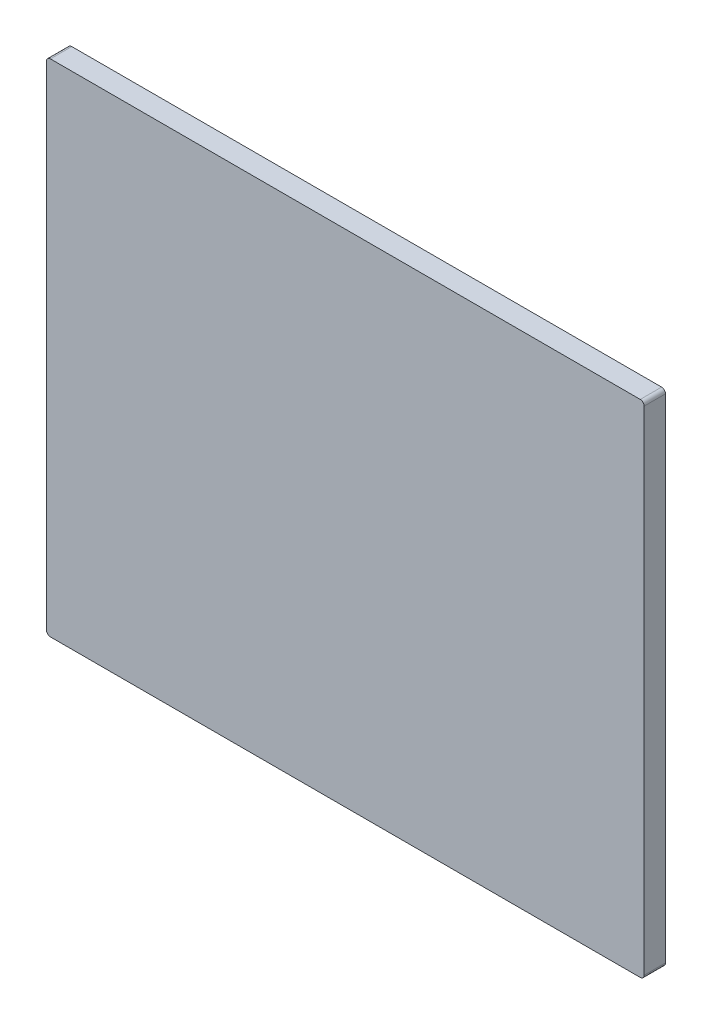
ISO-10303-21;
HEADER;
FILE_DESCRIPTION(('STEP AP214'),'2;1');
FILE_NAME('part.step','',(''),(''),'','','');
FILE_SCHEMA(('AUTOMOTIVE_DESIGN { 1 0 10303 214 1 1 1 1 }'));
ENDSEC;
DATA;
#1=APPLICATION_CONTEXT('core data for automotive mechanical design processes');
#2=APPLICATION_PROTOCOL_DEFINITION('international standard','automotive_design',2000,#1);
#3=PRODUCT_CONTEXT('',#1,'mechanical');
#4=PRODUCT('Part','Part','',(#3));
#5=PRODUCT_RELATED_PRODUCT_CATEGORY('part','',(#4));
#6=PRODUCT_DEFINITION_FORMATION('','',#4);
#7=PRODUCT_DEFINITION_CONTEXT('part definition',#1,'design');
#8=PRODUCT_DEFINITION('design','',#6,#7);
#9=PRODUCT_DEFINITION_SHAPE('','',#8);
#10=(LENGTH_UNIT() NAMED_UNIT(*) SI_UNIT(.MILLI.,.METRE.));
#11=(NAMED_UNIT(*) PLANE_ANGLE_UNIT() SI_UNIT($,.RADIAN.));
#12=(NAMED_UNIT(*) SI_UNIT($,.STERADIAN.) SOLID_ANGLE_UNIT());
#13=UNCERTAINTY_MEASURE_WITH_UNIT(LENGTH_MEASURE(1.E-05),#10,'distance_accuracy_value','');
#14=(GEOMETRIC_REPRESENTATION_CONTEXT(3) GLOBAL_UNCERTAINTY_ASSIGNED_CONTEXT((#13)) GLOBAL_UNIT_ASSIGNED_CONTEXT((#10,
#11,#12)) REPRESENTATION_CONTEXT('',''));
#15=CARTESIAN_POINT('',(0.,0.,0.));
#16=DIRECTION('',(0.,0.,1.));
#17=DIRECTION('',(1.,0.,0.));
#18=AXIS2_PLACEMENT_3D('',#15,#16,#17);
#19=CARTESIAN_POINT('',(154.,-129.,11.));
#20=DIRECTION('',(-1.,0.,0.));
#21=DIRECTION('',(0.,0.,1.));
#22=AXIS2_PLACEMENT_3D('',#19,#20,#21);
#23=PLANE('',#22);
#24=DIRECTION('',(0.,1.,0.));
#25=VECTOR('',#24,1.);
#26=CARTESIAN_POINT('',(154.,-129.,11.));
#27=LINE('',#26,#25);
#28=CARTESIAN_POINT('',(154.,-127.,11.));
#29=VERTEX_POINT('',#28);
#30=CARTESIAN_POINT('',(154.,127.,11.));
#31=VERTEX_POINT('',#30);
#32=EDGE_CURVE('E127',#29,#31,#27,.T.);
#33=ORIENTED_EDGE('',*,*,#32,.F.);
#34=DIRECTION('',(0.,0.,-1.));
#35=VECTOR('',#34,1.);
#36=CARTESIAN_POINT('',(154.,-127.,11.));
#37=LINE('',#36,#35);
#38=CARTESIAN_POINT('',(154.,-127.,0.));
#39=VERTEX_POINT('',#38);
#40=EDGE_CURVE('E153',#29,#39,#37,.T.);
#41=ORIENTED_EDGE('',*,*,#40,.T.);
#42=DIRECTION('',(0.,1.,0.));
#43=VECTOR('',#42,1.);
#44=CARTESIAN_POINT('',(154.,-129.,0.));
#45=LINE('',#44,#43);
#46=CARTESIAN_POINT('',(154.,127.,0.));
#47=VERTEX_POINT('',#46);
#48=EDGE_CURVE('E159',#39,#47,#45,.T.);
#49=ORIENTED_EDGE('',*,*,#48,.T.);
#50=DIRECTION('',(0.,0.,-1.));
#51=VECTOR('',#50,1.);
#52=CARTESIAN_POINT('',(154.,127.,11.));
#53=LINE('',#52,#51);
#54=EDGE_CURVE('E151',#47,#31,#53,.F.);
#55=ORIENTED_EDGE('',*,*,#54,.T.);
#56=EDGE_LOOP('',(#33,#41,#49,#55));
#57=FACE_BOUND('',#56,.T.);
#58=ADVANCED_FACE('F35',(#57),#23,.F.);
#59=CARTESIAN_POINT('',(-154.,129.,11.));
#60=DIRECTION('',(0.,-1.,0.));
#61=DIRECTION('',(0.,0.,-1.));
#62=AXIS2_PLACEMENT_3D('',#59,#60,#61);
#63=PLANE('',#62);
#64=DIRECTION('',(-1.,0.,0.));
#65=VECTOR('',#64,1.);
#66=CARTESIAN_POINT('',(-154.,129.,11.));
#67=LINE('',#66,#65);
#68=CARTESIAN_POINT('',(152.,129.,11.));
#69=VERTEX_POINT('',#68);
#70=CARTESIAN_POINT('',(-152.,129.,11.));
#71=VERTEX_POINT('',#70);
#72=EDGE_CURVE('E130',#69,#71,#67,.T.);
#73=ORIENTED_EDGE('',*,*,#72,.F.);
#74=DIRECTION('',(0.,0.,-1.));
#75=VECTOR('',#74,1.);
#76=CARTESIAN_POINT('',(152.,129.,11.));
#77=LINE('',#76,#75);
#78=CARTESIAN_POINT('',(152.,129.,0.));
#79=VERTEX_POINT('',#78);
#80=EDGE_CURVE('E11',#69,#79,#77,.T.);
#81=ORIENTED_EDGE('',*,*,#80,.T.);
#82=DIRECTION('',(-1.,0.,0.));
#83=VECTOR('',#82,1.);
#84=CARTESIAN_POINT('',(-154.,129.,0.));
#85=LINE('',#84,#83);
#86=CARTESIAN_POINT('',(-152.,129.,0.));
#87=VERTEX_POINT('',#86);
#88=EDGE_CURVE('E132',#79,#87,#85,.T.);
#89=ORIENTED_EDGE('',*,*,#88,.T.);
#90=DIRECTION('',(0.,0.,-1.));
#91=VECTOR('',#90,1.);
#92=CARTESIAN_POINT('',(-152.,129.,11.));
#93=LINE('',#92,#91);
#94=EDGE_CURVE('E43',#87,#71,#93,.F.);
#95=ORIENTED_EDGE('',*,*,#94,.T.);
#96=EDGE_LOOP('',(#73,#81,#89,#95));
#97=FACE_BOUND('',#96,.T.);
#98=ADVANCED_FACE('F178',(#97),#63,.F.);
#99=CARTESIAN_POINT('',(-154.,-129.,11.));
#100=DIRECTION('',(1.,0.,0.));
#101=DIRECTION('',(0.,0.,-1.));
#102=AXIS2_PLACEMENT_3D('',#99,#100,#101);
#103=PLANE('',#102);
#104=DIRECTION('',(0.,-1.,0.));
#105=VECTOR('',#104,1.);
#106=CARTESIAN_POINT('',(-154.,-129.,0.));
#107=LINE('',#106,#105);
#108=CARTESIAN_POINT('',(-154.,127.,0.));
#109=VERTEX_POINT('',#108);
#110=CARTESIAN_POINT('',(-154.,-127.,0.));
#111=VERTEX_POINT('',#110);
#112=EDGE_CURVE('E128',#109,#111,#107,.T.);
#113=ORIENTED_EDGE('',*,*,#112,.T.);
#114=DIRECTION('',(0.,0.,-1.));
#115=VECTOR('',#114,1.);
#116=CARTESIAN_POINT('',(-154.,-127.,11.));
#117=LINE('',#116,#115);
#118=CARTESIAN_POINT('',(-154.,-127.,11.));
#119=VERTEX_POINT('',#118);
#120=EDGE_CURVE('E106',#111,#119,#117,.F.);
#121=ORIENTED_EDGE('',*,*,#120,.T.);
#122=DIRECTION('',(0.,-1.,0.));
#123=VECTOR('',#122,1.);
#124=CARTESIAN_POINT('',(-154.,-129.,11.));
#125=LINE('',#124,#123);
#126=CARTESIAN_POINT('',(-154.,127.,11.));
#127=VERTEX_POINT('',#126);
#128=EDGE_CURVE('E167',#127,#119,#125,.T.);
#129=ORIENTED_EDGE('',*,*,#128,.F.);
#130=DIRECTION('',(0.,0.,-1.));
#131=VECTOR('',#130,1.);
#132=CARTESIAN_POINT('',(-154.,127.,11.));
#133=LINE('',#132,#131);
#134=EDGE_CURVE('E111',#127,#109,#133,.T.);
#135=ORIENTED_EDGE('',*,*,#134,.T.);
#136=EDGE_LOOP('',(#113,#121,#129,#135));
#137=FACE_BOUND('',#136,.T.);
#138=ADVANCED_FACE('F177',(#137),#103,.F.);
#139=CARTESIAN_POINT('',(-154.,-129.,11.));
#140=DIRECTION('',(0.,1.,0.));
#141=DIRECTION('',(0.,0.,1.));
#142=AXIS2_PLACEMENT_3D('',#139,#140,#141);
#143=PLANE('',#142);
#144=DIRECTION('',(1.,0.,0.));
#145=VECTOR('',#144,1.);
#146=CARTESIAN_POINT('',(-154.,-129.,11.));
#147=LINE('',#146,#145);
#148=CARTESIAN_POINT('',(-152.,-129.,11.));
#149=VERTEX_POINT('',#148);
#150=CARTESIAN_POINT('',(152.,-129.,11.));
#151=VERTEX_POINT('',#150);
#152=EDGE_CURVE('E121',#149,#151,#147,.T.);
#153=ORIENTED_EDGE('',*,*,#152,.F.);
#154=DIRECTION('',(0.,0.,-1.));
#155=VECTOR('',#154,1.);
#156=CARTESIAN_POINT('',(-152.,-129.,11.));
#157=LINE('',#156,#155);
#158=CARTESIAN_POINT('',(-152.,-129.,0.));
#159=VERTEX_POINT('',#158);
#160=EDGE_CURVE('E105',#149,#159,#157,.T.);
#161=ORIENTED_EDGE('',*,*,#160,.T.);
#162=DIRECTION('',(1.,0.,0.));
#163=VECTOR('',#162,1.);
#164=CARTESIAN_POINT('',(-154.,-129.,0.));
#165=LINE('',#164,#163);
#166=CARTESIAN_POINT('',(152.,-129.,0.));
#167=VERTEX_POINT('',#166);
#168=EDGE_CURVE('E118',#159,#167,#165,.T.);
#169=ORIENTED_EDGE('',*,*,#168,.T.);
#170=DIRECTION('',(0.,0.,-1.));
#171=VECTOR('',#170,1.);
#172=CARTESIAN_POINT('',(152.,-129.,11.));
#173=LINE('',#172,#171);
#174=EDGE_CURVE('E123',#167,#151,#173,.F.);
#175=ORIENTED_EDGE('',*,*,#174,.T.);
#176=EDGE_LOOP('',(#153,#161,#169,#175));
#177=FACE_BOUND('',#176,.T.);
#178=ADVANCED_FACE('F117',(#177),#143,.F.);
#179=CARTESIAN_POINT('',(0.,0.,11.));
#180=DIRECTION('',(0.,0.,-1.));
#181=DIRECTION('',(-1.,0.,0.));
#182=AXIS2_PLACEMENT_3D('',#179,#180,#181);
#183=PLANE('',#182);
#184=ORIENTED_EDGE('',*,*,#128,.T.);
#185=CARTESIAN_POINT('',(-152.,-127.,11.));
#186=DIRECTION('',(0.,0.,-1.));
#187=DIRECTION('',(-1.,0.,0.));
#188=AXIS2_PLACEMENT_3D('',#185,#186,#187);
#189=CIRCLE('',#188,2.);
#190=EDGE_CURVE('E149',#119,#149,#189,.F.);
#191=ORIENTED_EDGE('',*,*,#190,.T.);
#192=ORIENTED_EDGE('',*,*,#152,.T.);
#193=CARTESIAN_POINT('',(152.,-127.,11.));
#194=DIRECTION('',(0.,0.,-1.));
#195=DIRECTION('',(-1.,0.,0.));
#196=AXIS2_PLACEMENT_3D('',#193,#194,#195);
#197=CIRCLE('',#196,2.);
#198=EDGE_CURVE('E147',#151,#29,#197,.F.);
#199=ORIENTED_EDGE('',*,*,#198,.T.);
#200=ORIENTED_EDGE('',*,*,#32,.T.);
#201=CARTESIAN_POINT('',(152.,127.,11.));
#202=DIRECTION('',(0.,0.,-1.));
#203=DIRECTION('',(-1.,0.,0.));
#204=AXIS2_PLACEMENT_3D('',#201,#202,#203);
#205=CIRCLE('',#204,2.);
#206=EDGE_CURVE('E56',#31,#69,#205,.F.);
#207=ORIENTED_EDGE('',*,*,#206,.T.);
#208=ORIENTED_EDGE('',*,*,#72,.T.);
#209=CARTESIAN_POINT('',(-152.,127.,11.));
#210=DIRECTION('',(0.,0.,-1.));
#211=DIRECTION('',(-1.,0.,0.));
#212=AXIS2_PLACEMENT_3D('',#209,#210,#211);
#213=CIRCLE('',#212,2.);
#214=EDGE_CURVE('E144',#71,#127,#213,.F.);
#215=ORIENTED_EDGE('',*,*,#214,.T.);
#216=EDGE_LOOP('',(#184,#191,#192,#199,#200,#207,#208,#215));
#217=FACE_BOUND('',#216,.T.);
#218=ADVANCED_FACE('F171',(#217),#183,.F.);
#219=CARTESIAN_POINT('',(0.,0.,0.));
#220=DIRECTION('',(0.,0.,-1.));
#221=DIRECTION('',(-1.,0.,0.));
#222=AXIS2_PLACEMENT_3D('',#219,#220,#221);
#223=PLANE('',#222);
#224=ORIENTED_EDGE('',*,*,#168,.F.);
#225=CARTESIAN_POINT('',(-152.,-127.,0.));
#226=DIRECTION('',(0.,0.,-1.));
#227=DIRECTION('',(-1.,0.,0.));
#228=AXIS2_PLACEMENT_3D('',#225,#226,#227);
#229=CIRCLE('',#228,2.);
#230=EDGE_CURVE('E101',#159,#111,#229,.T.);
#231=ORIENTED_EDGE('',*,*,#230,.T.);
#232=ORIENTED_EDGE('',*,*,#112,.F.);
#233=CARTESIAN_POINT('',(-152.,127.,0.));
#234=DIRECTION('',(0.,0.,-1.));
#235=DIRECTION('',(-1.,0.,0.));
#236=AXIS2_PLACEMENT_3D('',#233,#234,#235);
#237=CIRCLE('',#236,2.);
#238=EDGE_CURVE('E122',#109,#87,#237,.T.);
#239=ORIENTED_EDGE('',*,*,#238,.T.);
#240=ORIENTED_EDGE('',*,*,#88,.F.);
#241=CARTESIAN_POINT('',(152.,127.,0.));
#242=DIRECTION('',(0.,0.,-1.));
#243=DIRECTION('',(-1.,0.,0.));
#244=AXIS2_PLACEMENT_3D('',#241,#242,#243);
#245=CIRCLE('',#244,2.);
#246=EDGE_CURVE('E138',#79,#47,#245,.T.);
#247=ORIENTED_EDGE('',*,*,#246,.T.);
#248=ORIENTED_EDGE('',*,*,#48,.F.);
#249=CARTESIAN_POINT('',(152.,-127.,0.));
#250=DIRECTION('',(0.,0.,-1.));
#251=DIRECTION('',(-1.,0.,0.));
#252=AXIS2_PLACEMENT_3D('',#249,#250,#251);
#253=CIRCLE('',#252,2.);
#254=EDGE_CURVE('E112',#39,#167,#253,.T.);
#255=ORIENTED_EDGE('',*,*,#254,.T.);
#256=EDGE_LOOP('',(#224,#231,#232,#239,#240,#247,#248,#255));
#257=FACE_BOUND('',#256,.T.);
#258=ADVANCED_FACE('F125',(#257),#223,.T.);
#259=CARTESIAN_POINT('',(-152.,-127.,11.));
#260=DIRECTION('',(0.,0.,-1.));
#261=DIRECTION('',(-1.,0.,0.));
#262=AXIS2_PLACEMENT_3D('',#259,#260,#261);
#263=CYLINDRICAL_SURFACE('',#262,2.);
#264=ORIENTED_EDGE('',*,*,#190,.F.);
#265=ORIENTED_EDGE('',*,*,#120,.F.);
#266=ORIENTED_EDGE('',*,*,#230,.F.);
#267=ORIENTED_EDGE('',*,*,#160,.F.);
#268=EDGE_LOOP('',(#264,#265,#266,#267));
#269=FACE_BOUND('',#268,.T.);
#270=ADVANCED_FACE('F104',(#269),#263,.T.);
#271=CARTESIAN_POINT('',(152.,-127.,11.));
#272=DIRECTION('',(0.,0.,-1.));
#273=DIRECTION('',(-1.,0.,0.));
#274=AXIS2_PLACEMENT_3D('',#271,#272,#273);
#275=CYLINDRICAL_SURFACE('',#274,2.);
#276=ORIENTED_EDGE('',*,*,#198,.F.);
#277=ORIENTED_EDGE('',*,*,#174,.F.);
#278=ORIENTED_EDGE('',*,*,#254,.F.);
#279=ORIENTED_EDGE('',*,*,#40,.F.);
#280=EDGE_LOOP('',(#276,#277,#278,#279));
#281=FACE_BOUND('',#280,.T.);
#282=ADVANCED_FACE('F181',(#281),#275,.T.);
#283=CARTESIAN_POINT('',(152.,127.,11.));
#284=DIRECTION('',(0.,0.,-1.));
#285=DIRECTION('',(-1.,0.,0.));
#286=AXIS2_PLACEMENT_3D('',#283,#284,#285);
#287=CYLINDRICAL_SURFACE('',#286,2.);
#288=ORIENTED_EDGE('',*,*,#206,.F.);
#289=ORIENTED_EDGE('',*,*,#54,.F.);
#290=ORIENTED_EDGE('',*,*,#246,.F.);
#291=ORIENTED_EDGE('',*,*,#80,.F.);
#292=EDGE_LOOP('',(#288,#289,#290,#291));
#293=FACE_BOUND('',#292,.T.);
#294=ADVANCED_FACE('F180',(#293),#287,.T.);
#295=CARTESIAN_POINT('',(-152.,127.,11.));
#296=DIRECTION('',(0.,0.,-1.));
#297=DIRECTION('',(-1.,0.,0.));
#298=AXIS2_PLACEMENT_3D('',#295,#296,#297);
#299=CYLINDRICAL_SURFACE('',#298,2.);
#300=ORIENTED_EDGE('',*,*,#214,.F.);
#301=ORIENTED_EDGE('',*,*,#94,.F.);
#302=ORIENTED_EDGE('',*,*,#238,.F.);
#303=ORIENTED_EDGE('',*,*,#134,.F.);
#304=EDGE_LOOP('',(#300,#301,#302,#303));
#305=FACE_BOUND('',#304,.T.);
#306=ADVANCED_FACE('F37',(#305),#299,.T.);
#307=CLOSED_SHELL('',(#58,#98,#138,#178,#218,#258,#270,#282,#294,#306));
#308=MANIFOLD_SOLID_BREP('B2',#307);
#309=ADVANCED_BREP_SHAPE_REPRESENTATION('',(#18,#308),#14);
#310=SHAPE_DEFINITION_REPRESENTATION(#9,#309);
ENDSEC;
END-ISO-10303-21;
